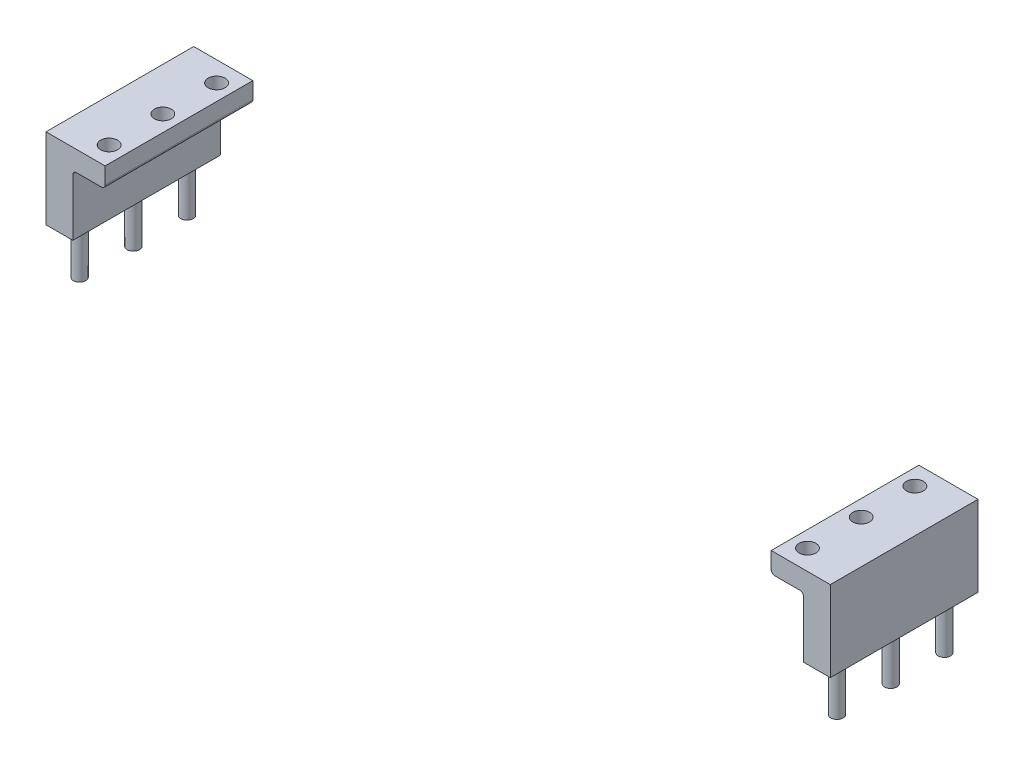
ISO-10303-21;
HEADER;
FILE_DESCRIPTION(('STEP AP214'),'2;1');
FILE_NAME('part.step','',(''),(''),'','','');
FILE_SCHEMA(('AUTOMOTIVE_DESIGN { 1 0 10303 214 1 1 1 1 }'));
ENDSEC;
DATA;
#1=APPLICATION_CONTEXT('core data for automotive mechanical design processes');
#2=APPLICATION_PROTOCOL_DEFINITION('international standard','automotive_design',2000,#1);
#3=PRODUCT_CONTEXT('',#1,'mechanical');
#4=PRODUCT('Part','Part','',(#3));
#5=PRODUCT_RELATED_PRODUCT_CATEGORY('part','',(#4));
#6=PRODUCT_DEFINITION_FORMATION('','',#4);
#7=PRODUCT_DEFINITION_CONTEXT('part definition',#1,'design');
#8=PRODUCT_DEFINITION('design','',#6,#7);
#9=PRODUCT_DEFINITION_SHAPE('','',#8);
#10=(LENGTH_UNIT() NAMED_UNIT(*) SI_UNIT(.MILLI.,.METRE.));
#11=(NAMED_UNIT(*) PLANE_ANGLE_UNIT() SI_UNIT($,.RADIAN.));
#12=(NAMED_UNIT(*) SI_UNIT($,.STERADIAN.) SOLID_ANGLE_UNIT());
#13=UNCERTAINTY_MEASURE_WITH_UNIT(LENGTH_MEASURE(1.E-05),#10,'distance_accuracy_value','');
#14=(GEOMETRIC_REPRESENTATION_CONTEXT(3) GLOBAL_UNCERTAINTY_ASSIGNED_CONTEXT((#13)) GLOBAL_UNIT_ASSIGNED_CONTEXT((#10,
#11,#12)) REPRESENTATION_CONTEXT('',''));
#15=CARTESIAN_POINT('',(0.,0.,0.));
#16=DIRECTION('',(0.,0.,1.));
#17=DIRECTION('',(1.,0.,0.));
#18=AXIS2_PLACEMENT_3D('',#15,#16,#17);
#19=CARTESIAN_POINT('',(184.05475,-81.3562,76.2));
#20=DIRECTION('',(0.,1.,0.));
#21=DIRECTION('',(0.,0.,1.));
#22=AXIS2_PLACEMENT_3D('',#19,#20,#21);
#23=PLANE('',#22);
#24=CARTESIAN_POINT('',(184.785,-81.3562,76.2));
#25=DIRECTION('',(0.,1.,0.));
#26=DIRECTION('',(0.,0.,-1.));
#27=AXIS2_PLACEMENT_3D('',#24,#25,#26);
#28=CIRCLE('',#27,1.4605);
#29=CARTESIAN_POINT('',(184.785,-81.3562,74.7395));
#30=VERTEX_POINT('',#29);
#31=EDGE_CURVE('P0_E11',#30,#30,#28,.T.);
#32=ORIENTED_EDGE('',*,*,#31,.F.);
#33=EDGE_LOOP('',(#32));
#34=FACE_BOUND('',#33,.T.);
#35=ADVANCED_FACE('P0_F17',(#34),#23,.F.);
#36=CARTESIAN_POINT('',(184.785,-75.6031,76.2));
#37=DIRECTION('',(0.,-1.,0.));
#38=DIRECTION('',(0.,0.,-1.));
#39=AXIS2_PLACEMENT_3D('',#36,#37,#38);
#40=CYLINDRICAL_SURFACE('',#39,1.4605);
#41=ORIENTED_EDGE('',*,*,#31,.T.);
#42=EDGE_LOOP('',(#41));
#43=FACE_BOUND('',#42,.T.);
#44=CARTESIAN_POINT('',(184.785,-71.12,76.2));
#45=DIRECTION('',(0.,1.,0.));
#46=DIRECTION('',(0.,0.,-1.));
#47=AXIS2_PLACEMENT_3D('',#44,#45,#46);
#48=CIRCLE('',#47,1.4605);
#49=CARTESIAN_POINT('',(184.785,-71.12,74.7395));
#50=VERTEX_POINT('',#49);
#51=EDGE_CURVE('P0_E164',#50,#50,#48,.T.);
#52=ORIENTED_EDGE('',*,*,#51,.F.);
#53=EDGE_LOOP('',(#52));
#54=FACE_BOUND('',#53,.T.);
#55=ADVANCED_FACE('P0_F175',(#43,#54),#40,.T.);
#56=CARTESIAN_POINT('',(184.785,-69.85,76.2));
#57=DIRECTION('',(0.,1.,0.));
#58=DIRECTION('',(0.,0.,1.));
#59=AXIS2_PLACEMENT_3D('',#56,#57,#58);
#60=CONICAL_SURFACE('',#59,2.7686,0.800175412804941);
#61=ORIENTED_EDGE('',*,*,#51,.T.);
#62=EDGE_LOOP('',(#61));
#63=FACE_BOUND('',#62,.T.);
#64=CARTESIAN_POINT('',(184.785,-69.85,76.2));
#65=DIRECTION('',(0.,1.,0.));
#66=DIRECTION('',(0.,0.,-1.));
#67=AXIS2_PLACEMENT_3D('',#64,#65,#66);
#68=CIRCLE('',#67,2.7686);
#69=CARTESIAN_POINT('',(184.785,-69.85,73.4314));
#70=VERTEX_POINT('',#69);
#71=EDGE_CURVE('P0_E24',#70,#70,#68,.T.);
#72=ORIENTED_EDGE('',*,*,#71,.F.);
#73=EDGE_LOOP('',(#72));
#74=FACE_BOUND('',#73,.T.);
#75=ADVANCED_FACE('P0_F172',(#63,#74),#60,.T.);
#76=CARTESIAN_POINT('',(184.05475,-81.3562,88.9));
#77=DIRECTION('',(0.,1.,0.));
#78=DIRECTION('',(0.,0.,1.));
#79=AXIS2_PLACEMENT_3D('',#76,#77,#78);
#80=PLANE('',#79);
#81=CARTESIAN_POINT('',(184.785,-81.3562,88.9));
#82=DIRECTION('',(0.,1.,0.));
#83=DIRECTION('',(0.,0.,-1.));
#84=AXIS2_PLACEMENT_3D('',#81,#82,#83);
#85=CIRCLE('',#84,1.4605);
#86=CARTESIAN_POINT('',(184.785,-81.3562,87.4395));
#87=VERTEX_POINT('',#86);
#88=EDGE_CURVE('P0_E161',#87,#87,#85,.T.);
#89=ORIENTED_EDGE('',*,*,#88,.F.);
#90=EDGE_LOOP('',(#89));
#91=FACE_BOUND('',#90,.T.);
#92=ADVANCED_FACE('P0_F174',(#91),#80,.F.);
#93=CARTESIAN_POINT('',(184.785,-75.6031,88.9));
#94=DIRECTION('',(0.,-1.,0.));
#95=DIRECTION('',(0.,0.,-1.));
#96=AXIS2_PLACEMENT_3D('',#93,#94,#95);
#97=CYLINDRICAL_SURFACE('',#96,1.4605);
#98=ORIENTED_EDGE('',*,*,#88,.T.);
#99=EDGE_LOOP('',(#98));
#100=FACE_BOUND('',#99,.T.);
#101=CARTESIAN_POINT('',(184.785,-71.12,88.9));
#102=DIRECTION('',(0.,1.,0.));
#103=DIRECTION('',(0.,0.,-1.));
#104=AXIS2_PLACEMENT_3D('',#101,#102,#103);
#105=CIRCLE('',#104,1.4605);
#106=CARTESIAN_POINT('',(184.785,-71.12,87.4395));
#107=VERTEX_POINT('',#106);
#108=EDGE_CURVE('P0_E155',#107,#107,#105,.T.);
#109=ORIENTED_EDGE('',*,*,#108,.F.);
#110=EDGE_LOOP('',(#109));
#111=FACE_BOUND('',#110,.T.);
#112=ADVANCED_FACE('P0_F183',(#100,#111),#97,.T.);
#113=CARTESIAN_POINT('',(184.785,-69.85,88.9));
#114=DIRECTION('',(0.,1.,0.));
#115=DIRECTION('',(0.,0.,1.));
#116=AXIS2_PLACEMENT_3D('',#113,#114,#115);
#117=CONICAL_SURFACE('',#116,2.7686,0.800175412804941);
#118=ORIENTED_EDGE('',*,*,#108,.T.);
#119=EDGE_LOOP('',(#118));
#120=FACE_BOUND('',#119,.T.);
#121=CARTESIAN_POINT('',(184.785,-69.85,88.9));
#122=DIRECTION('',(0.,1.,0.));
#123=DIRECTION('',(0.,0.,-1.));
#124=AXIS2_PLACEMENT_3D('',#121,#122,#123);
#125=CIRCLE('',#124,2.7686);
#126=CARTESIAN_POINT('',(184.785,-69.85,86.1314));
#127=VERTEX_POINT('',#126);
#128=EDGE_CURVE('P0_E158',#127,#127,#125,.T.);
#129=ORIENTED_EDGE('',*,*,#128,.F.);
#130=EDGE_LOOP('',(#129));
#131=FACE_BOUND('',#130,.T.);
#132=ADVANCED_FACE('P0_F222',(#120,#131),#117,.T.);
#133=CARTESIAN_POINT('',(173.99,-53.18125,106.3625));
#134=DIRECTION('',(1.,0.,0.));
#135=DIRECTION('',(0.,0.,1.));
#136=AXIS2_PLACEMENT_3D('',#133,#134,#135);
#137=PLANE('',#136);
#138=DIRECTION('',(0.,1.,0.));
#139=VECTOR('',#138,1.);
#140=CARTESIAN_POINT('',(173.99,-53.18125,106.3625));
#141=LINE('',#140,#139);
#142=CARTESIAN_POINT('',(173.99,-54.7243,106.3625));
#143=VERTEX_POINT('',#142);
#144=CARTESIAN_POINT('',(173.99,-50.8,106.3625));
#145=VERTEX_POINT('',#144);
#146=EDGE_CURVE('P0_E82',#143,#145,#141,.T.);
#147=ORIENTED_EDGE('',*,*,#146,.T.);
#148=DIRECTION('',(0.,0.,-1.));
#149=VECTOR('',#148,1.);
#150=CARTESIAN_POINT('',(173.99,-50.8,106.3625));
#151=LINE('',#150,#149);
#152=CARTESIAN_POINT('',(173.99,-50.8,71.4375));
#153=VERTEX_POINT('',#152);
#154=EDGE_CURVE('P0_E90',#145,#153,#151,.T.);
#155=ORIENTED_EDGE('',*,*,#154,.T.);
#156=DIRECTION('',(0.,1.,0.));
#157=VECTOR('',#156,1.);
#158=CARTESIAN_POINT('',(173.99,-53.18125,71.4375));
#159=LINE('',#158,#157);
#160=CARTESIAN_POINT('',(173.99,-54.7243,71.4375));
#161=VERTEX_POINT('',#160);
#162=EDGE_CURVE('P0_E123',#161,#153,#159,.T.);
#163=ORIENTED_EDGE('',*,*,#162,.F.);
#164=DIRECTION('',(0.,0.,-1.));
#165=VECTOR('',#164,1.);
#166=CARTESIAN_POINT('',(173.99,-54.7243,106.3625));
#167=LINE('',#166,#165);
#168=EDGE_CURVE('P0_E97',#143,#161,#167,.T.);
#169=ORIENTED_EDGE('',*,*,#168,.F.);
#170=EDGE_LOOP('',(#147,#155,#163,#169));
#171=FACE_BOUND('',#170,.T.);
#172=ADVANCED_FACE('P0_F101',(#171),#137,.F.);
#173=CARTESIAN_POINT('',(180.975,-50.8,106.3625));
#174=DIRECTION('',(0.,-1.,0.));
#175=DIRECTION('',(0.,0.,-1.));
#176=AXIS2_PLACEMENT_3D('',#173,#174,#175);
#177=PLANE('',#176);
#178=CARTESIAN_POINT('',(177.8,-50.8,101.6));
#179=DIRECTION('',(0.,1.,0.));
#180=DIRECTION('',(0.,0.,-1.));
#181=AXIS2_PLACEMENT_3D('',#178,#179,#180);
#182=CIRCLE('',#181,1.9939);
#183=CARTESIAN_POINT('',(177.8,-50.8,99.6061));
#184=VERTEX_POINT('',#183);
#185=EDGE_CURVE('P0_E109',#184,#184,#182,.T.);
#186=ORIENTED_EDGE('',*,*,#185,.F.);
#187=EDGE_LOOP('',(#186));
#188=FACE_BOUND('',#187,.T.);
#189=CARTESIAN_POINT('',(177.8,-50.8,88.9));
#190=DIRECTION('',(0.,1.,0.));
#191=DIRECTION('',(0.,0.,-1.));
#192=AXIS2_PLACEMENT_3D('',#189,#190,#191);
#193=CIRCLE('',#192,1.9939);
#194=CARTESIAN_POINT('',(177.8,-50.8,86.9061));
#195=VERTEX_POINT('',#194);
#196=EDGE_CURVE('P0_E415',#195,#195,#193,.T.);
#197=ORIENTED_EDGE('',*,*,#196,.F.);
#198=EDGE_LOOP('',(#197));
#199=FACE_BOUND('',#198,.T.);
#200=CARTESIAN_POINT('',(177.8,-50.8,76.2));
#201=DIRECTION('',(0.,1.,0.));
#202=DIRECTION('',(0.,0.,-1.));
#203=AXIS2_PLACEMENT_3D('',#200,#201,#202);
#204=CIRCLE('',#203,1.9939);
#205=CARTESIAN_POINT('',(177.8,-50.8,74.2061));
#206=VERTEX_POINT('',#205);
#207=EDGE_CURVE('P0_E408',#206,#206,#204,.T.);
#208=ORIENTED_EDGE('',*,*,#207,.F.);
#209=EDGE_LOOP('',(#208));
#210=FACE_BOUND('',#209,.T.);
#211=DIRECTION('',(1.,0.,0.));
#212=VECTOR('',#211,1.);
#213=CARTESIAN_POINT('',(180.975,-50.8,71.4375));
#214=LINE('',#213,#212);
#215=CARTESIAN_POINT('',(187.96,-50.8,71.4375));
#216=VERTEX_POINT('',#215);
#217=EDGE_CURVE('P0_E93',#153,#216,#214,.T.);
#218=ORIENTED_EDGE('',*,*,#217,.F.);
#219=ORIENTED_EDGE('',*,*,#154,.F.);
#220=DIRECTION('',(1.,0.,0.));
#221=VECTOR('',#220,1.);
#222=CARTESIAN_POINT('',(180.975,-50.8,106.3625));
#223=LINE('',#222,#221);
#224=CARTESIAN_POINT('',(187.96,-50.8,106.3625));
#225=VERTEX_POINT('',#224);
#226=EDGE_CURVE('P0_E78',#145,#225,#223,.T.);
#227=ORIENTED_EDGE('',*,*,#226,.T.);
#228=DIRECTION('',(0.,0.,-1.));
#229=VECTOR('',#228,1.);
#230=CARTESIAN_POINT('',(187.96,-50.8,106.3625));
#231=LINE('',#230,#229);
#232=EDGE_CURVE('P0_E98',#225,#216,#231,.T.);
#233=ORIENTED_EDGE('',*,*,#232,.T.);
#234=EDGE_LOOP('',(#218,#219,#227,#233));
#235=FACE_BOUND('',#234,.T.);
#236=ADVANCED_FACE('P0_F91',(#188,#199,#210,#235),#177,.F.);
#237=CARTESIAN_POINT('',(187.96,-60.325,106.3625));
#238=DIRECTION('',(-1.,0.,0.));
#239=DIRECTION('',(0.,1.,0.));
#240=AXIS2_PLACEMENT_3D('',#237,#238,#239);
#241=PLANE('',#240);
#242=DIRECTION('',(0.,-1.,0.));
#243=VECTOR('',#242,1.);
#244=CARTESIAN_POINT('',(187.96,-60.325,71.4375));
#245=LINE('',#244,#243);
#246=CARTESIAN_POINT('',(187.96,-69.85,71.4375));
#247=VERTEX_POINT('',#246);
#248=EDGE_CURVE('P0_E126',#216,#247,#245,.T.);
#249=ORIENTED_EDGE('',*,*,#248,.F.);
#250=ORIENTED_EDGE('',*,*,#232,.F.);
#251=DIRECTION('',(0.,-1.,0.));
#252=VECTOR('',#251,1.);
#253=CARTESIAN_POINT('',(187.96,-60.325,106.3625));
#254=LINE('',#253,#252);
#255=CARTESIAN_POINT('',(187.96,-69.85,106.3625));
#256=VERTEX_POINT('',#255);
#257=EDGE_CURVE('P0_E84',#225,#256,#254,.T.);
#258=ORIENTED_EDGE('',*,*,#257,.T.);
#259=DIRECTION('',(0.,0.,-1.));
#260=VECTOR('',#259,1.);
#261=CARTESIAN_POINT('',(187.96,-69.85,106.3625));
#262=LINE('',#261,#260);
#263=EDGE_CURVE('P0_E136',#256,#247,#262,.T.);
#264=ORIENTED_EDGE('',*,*,#263,.T.);
#265=EDGE_LOOP('',(#249,#250,#258,#264));
#266=FACE_BOUND('',#265,.T.);
#267=ADVANCED_FACE('P0_F249',(#266),#241,.F.);
#268=CARTESIAN_POINT('',(184.785,-69.85,106.3625));
#269=DIRECTION('',(0.,1.,0.));
#270=DIRECTION('',(0.,0.,1.));
#271=AXIS2_PLACEMENT_3D('',#268,#269,#270);
#272=PLANE('',#271);
#273=ORIENTED_EDGE('',*,*,#71,.T.);
#274=EDGE_LOOP('',(#273));
#275=FACE_BOUND('',#274,.T.);
#276=ORIENTED_EDGE('',*,*,#128,.T.);
#277=EDGE_LOOP('',(#276));
#278=FACE_BOUND('',#277,.T.);
#279=CARTESIAN_POINT('',(184.785,-69.85,101.6));
#280=DIRECTION('',(0.,1.,0.));
#281=DIRECTION('',(0.,0.,-1.));
#282=AXIS2_PLACEMENT_3D('',#279,#280,#281);
#283=CIRCLE('',#282,2.7686);
#284=CARTESIAN_POINT('',(184.785,-69.85,98.8314));
#285=VERTEX_POINT('',#284);
#286=EDGE_CURVE('P0_E154',#285,#285,#283,.T.);
#287=ORIENTED_EDGE('',*,*,#286,.T.);
#288=EDGE_LOOP('',(#287));
#289=FACE_BOUND('',#288,.T.);
#290=DIRECTION('',(-1.,0.,0.));
#291=VECTOR('',#290,1.);
#292=CARTESIAN_POINT('',(184.785,-69.85,71.4375));
#293=LINE('',#292,#291);
#294=CARTESIAN_POINT('',(181.61,-69.85,71.4375));
#295=VERTEX_POINT('',#294);
#296=EDGE_CURVE('P0_E129',#247,#295,#293,.T.);
#297=ORIENTED_EDGE('',*,*,#296,.F.);
#298=ORIENTED_EDGE('',*,*,#263,.F.);
#299=DIRECTION('',(-1.,0.,0.));
#300=VECTOR('',#299,1.);
#301=CARTESIAN_POINT('',(184.785,-69.85,106.3625));
#302=LINE('',#301,#300);
#303=CARTESIAN_POINT('',(181.61,-69.85,106.3625));
#304=VERTEX_POINT('',#303);
#305=EDGE_CURVE('P0_E113',#256,#304,#302,.T.);
#306=ORIENTED_EDGE('',*,*,#305,.T.);
#307=DIRECTION('',(0.,0.,-1.));
#308=VECTOR('',#307,1.);
#309=CARTESIAN_POINT('',(181.61,-69.85,106.3625));
#310=LINE('',#309,#308);
#311=EDGE_CURVE('P0_E122',#304,#295,#310,.T.);
#312=ORIENTED_EDGE('',*,*,#311,.T.);
#313=EDGE_LOOP('',(#297,#298,#306,#312));
#314=FACE_BOUND('',#313,.T.);
#315=ADVANCED_FACE('P0_F169',(#275,#278,#289,#314),#272,.F.);
#316=CARTESIAN_POINT('',(181.61,-62.70625,106.3625));
#317=DIRECTION('',(1.,0.,0.));
#318=DIRECTION('',(0.,0.,1.));
#319=AXIS2_PLACEMENT_3D('',#316,#317,#318);
#320=PLANE('',#319);
#321=DIRECTION('',(0.,1.,0.));
#322=VECTOR('',#321,1.);
#323=CARTESIAN_POINT('',(181.61,-62.70625,71.4375));
#324=LINE('',#323,#322);
#325=CARTESIAN_POINT('',(181.61,-56.4007,71.4375));
#326=VERTEX_POINT('',#325);
#327=EDGE_CURVE('P0_E106',#295,#326,#324,.T.);
#328=ORIENTED_EDGE('',*,*,#327,.F.);
#329=ORIENTED_EDGE('',*,*,#311,.F.);
#330=DIRECTION('',(0.,1.,0.));
#331=VECTOR('',#330,1.);
#332=CARTESIAN_POINT('',(181.61,-62.70625,106.3625));
#333=LINE('',#332,#331);
#334=CARTESIAN_POINT('',(181.61,-56.4007,106.3625));
#335=VERTEX_POINT('',#334);
#336=EDGE_CURVE('P0_E116',#304,#335,#333,.T.);
#337=ORIENTED_EDGE('',*,*,#336,.T.);
#338=DIRECTION('',(0.,0.,-1.));
#339=VECTOR('',#338,1.);
#340=CARTESIAN_POINT('',(181.61,-56.4007,106.3625));
#341=LINE('',#340,#339);
#342=EDGE_CURVE('P0_E149',#326,#335,#341,.F.);
#343=ORIENTED_EDGE('',*,*,#342,.F.);
#344=EDGE_LOOP('',(#328,#329,#337,#343));
#345=FACE_BOUND('',#344,.T.);
#346=ADVANCED_FACE('P0_F268',(#345),#320,.F.);
#347=CARTESIAN_POINT('',(177.8,-55.5625,106.3625));
#348=DIRECTION('',(0.,1.,0.));
#349=DIRECTION('',(0.,0.,1.));
#350=AXIS2_PLACEMENT_3D('',#347,#348,#349);
#351=PLANE('',#350);
#352=CARTESIAN_POINT('',(177.8,-55.5625,101.6));
#353=DIRECTION('',(0.,1.,0.));
#354=DIRECTION('',(0.,0.,-1.));
#355=AXIS2_PLACEMENT_3D('',#352,#353,#354);
#356=CIRCLE('',#355,1.9939);
#357=CARTESIAN_POINT('',(177.8,-55.5625,99.6061));
#358=VERTEX_POINT('',#357);
#359=EDGE_CURVE('P0_E405',#358,#358,#356,.T.);
#360=ORIENTED_EDGE('',*,*,#359,.T.);
#361=EDGE_LOOP('',(#360));
#362=FACE_BOUND('',#361,.T.);
#363=CARTESIAN_POINT('',(177.8,-55.5625,88.9));
#364=DIRECTION('',(0.,1.,0.));
#365=DIRECTION('',(0.,0.,-1.));
#366=AXIS2_PLACEMENT_3D('',#363,#364,#365);
#367=CIRCLE('',#366,1.9939);
#368=CARTESIAN_POINT('',(177.8,-55.5625,86.9061));
#369=VERTEX_POINT('',#368);
#370=EDGE_CURVE('P0_E409',#369,#369,#367,.T.);
#371=ORIENTED_EDGE('',*,*,#370,.T.);
#372=EDGE_LOOP('',(#371));
#373=FACE_BOUND('',#372,.T.);
#374=CARTESIAN_POINT('',(177.8,-55.5625,76.2));
#375=DIRECTION('',(0.,1.,0.));
#376=DIRECTION('',(0.,0.,-1.));
#377=AXIS2_PLACEMENT_3D('',#374,#375,#376);
#378=CIRCLE('',#377,1.9939);
#379=CARTESIAN_POINT('',(177.8,-55.5625,74.2061));
#380=VERTEX_POINT('',#379);
#381=EDGE_CURVE('P0_E404',#380,#380,#378,.T.);
#382=ORIENTED_EDGE('',*,*,#381,.T.);
#383=EDGE_LOOP('',(#382));
#384=FACE_BOUND('',#383,.T.);
#385=DIRECTION('',(-1.,0.,0.));
#386=VECTOR('',#385,1.);
#387=CARTESIAN_POINT('',(177.8,-55.5625,71.4375));
#388=LINE('',#387,#386);
#389=CARTESIAN_POINT('',(180.7718,-55.5625,71.4375));
#390=VERTEX_POINT('',#389);
#391=CARTESIAN_POINT('',(174.8282,-55.5625,71.4375));
#392=VERTEX_POINT('',#391);
#393=EDGE_CURVE('P0_E103',#390,#392,#388,.T.);
#394=ORIENTED_EDGE('',*,*,#393,.F.);
#395=DIRECTION('',(0.,0.,-1.));
#396=VECTOR('',#395,1.);
#397=CARTESIAN_POINT('',(180.7718,-55.5625,71.4375));
#398=LINE('',#397,#396);
#399=CARTESIAN_POINT('',(180.7718,-55.5625,106.3625));
#400=VERTEX_POINT('',#399);
#401=EDGE_CURVE('P0_E143',#400,#390,#398,.T.);
#402=ORIENTED_EDGE('',*,*,#401,.F.);
#403=DIRECTION('',(-1.,0.,0.));
#404=VECTOR('',#403,1.);
#405=CARTESIAN_POINT('',(177.8,-55.5625,106.3625));
#406=LINE('',#405,#404);
#407=CARTESIAN_POINT('',(174.8282,-55.5625,106.3625));
#408=VERTEX_POINT('',#407);
#409=EDGE_CURVE('P0_E119',#400,#408,#406,.T.);
#410=ORIENTED_EDGE('',*,*,#409,.T.);
#411=DIRECTION('',(0.,0.,-1.));
#412=VECTOR('',#411,1.);
#413=CARTESIAN_POINT('',(174.8282,-55.5625,106.3625));
#414=LINE('',#413,#412);
#415=EDGE_CURVE('P0_E146',#392,#408,#414,.F.);
#416=ORIENTED_EDGE('',*,*,#415,.F.);
#417=EDGE_LOOP('',(#394,#402,#410,#416));
#418=FACE_BOUND('',#417,.T.);
#419=ADVANCED_FACE('P0_F277',(#362,#373,#384,#418),#351,.F.);
#420=CARTESIAN_POINT('',(180.975,-60.325,106.3625));
#421=DIRECTION('',(0.,0.,1.));
#422=DIRECTION('',(-1.,0.,0.));
#423=AXIS2_PLACEMENT_3D('',#420,#421,#422);
#424=PLANE('',#423);
#425=ORIENTED_EDGE('',*,*,#409,.F.);
#426=CARTESIAN_POINT('',(180.7718,-56.4007,106.3625));
#427=DIRECTION('',(0.,0.,-1.));
#428=DIRECTION('',(-1.,0.,0.));
#429=AXIS2_PLACEMENT_3D('',#426,#427,#428);
#430=CIRCLE('',#429,0.8382);
#431=EDGE_CURVE('P0_E31',#335,#400,#430,.F.);
#432=ORIENTED_EDGE('',*,*,#431,.F.);
#433=ORIENTED_EDGE('',*,*,#336,.F.);
#434=ORIENTED_EDGE('',*,*,#305,.F.);
#435=ORIENTED_EDGE('',*,*,#257,.F.);
#436=ORIENTED_EDGE('',*,*,#226,.F.);
#437=ORIENTED_EDGE('',*,*,#146,.F.);
#438=CARTESIAN_POINT('',(174.8282,-54.7243,106.3625));
#439=DIRECTION('',(0.,0.,-1.));
#440=DIRECTION('',(-1.,0.,0.));
#441=AXIS2_PLACEMENT_3D('',#438,#439,#440);
#442=CIRCLE('',#441,0.8382);
#443=EDGE_CURVE('P0_E37',#408,#143,#442,.T.);
#444=ORIENTED_EDGE('',*,*,#443,.F.);
#445=EDGE_LOOP('',(#425,#432,#433,#434,#435,#436,#437,#444));
#446=FACE_BOUND('',#445,.T.);
#447=ADVANCED_FACE('P0_F80',(#446),#424,.T.);
#448=CARTESIAN_POINT('',(180.975,-60.325,71.4375));
#449=DIRECTION('',(0.,0.,1.));
#450=DIRECTION('',(-1.,0.,0.));
#451=AXIS2_PLACEMENT_3D('',#448,#449,#450);
#452=PLANE('',#451);
#453=ORIENTED_EDGE('',*,*,#162,.T.);
#454=ORIENTED_EDGE('',*,*,#217,.T.);
#455=ORIENTED_EDGE('',*,*,#248,.T.);
#456=ORIENTED_EDGE('',*,*,#296,.T.);
#457=ORIENTED_EDGE('',*,*,#327,.T.);
#458=CARTESIAN_POINT('',(180.7718,-56.4007,71.4375));
#459=DIRECTION('',(0.,0.,-1.));
#460=DIRECTION('',(-1.,0.,0.));
#461=AXIS2_PLACEMENT_3D('',#458,#459,#460);
#462=CIRCLE('',#461,0.8382);
#463=EDGE_CURVE('P0_E151',#390,#326,#462,.T.);
#464=ORIENTED_EDGE('',*,*,#463,.F.);
#465=ORIENTED_EDGE('',*,*,#393,.T.);
#466=CARTESIAN_POINT('',(174.8282,-54.7243,71.4375));
#467=DIRECTION('',(0.,0.,-1.));
#468=DIRECTION('',(-1.,0.,0.));
#469=AXIS2_PLACEMENT_3D('',#466,#467,#468);
#470=CIRCLE('',#469,0.8382);
#471=EDGE_CURVE('P0_E141',#161,#392,#470,.F.);
#472=ORIENTED_EDGE('',*,*,#471,.F.);
#473=EDGE_LOOP('',(#453,#454,#455,#456,#457,#464,#465,#472));
#474=FACE_BOUND('',#473,.T.);
#475=ADVANCED_FACE('P0_F296',(#474),#452,.F.);
#476=CARTESIAN_POINT('',(177.8,-30.1625,76.2));
#477=DIRECTION('',(0.,-1.,0.));
#478=DIRECTION('',(0.,0.,-1.));
#479=AXIS2_PLACEMENT_3D('',#476,#477,#478);
#480=CYLINDRICAL_SURFACE('',#479,1.9939);
#481=ORIENTED_EDGE('',*,*,#381,.F.);
#482=EDGE_LOOP('',(#481));
#483=FACE_BOUND('',#482,.T.);
#484=ORIENTED_EDGE('',*,*,#207,.T.);
#485=EDGE_LOOP('',(#484));
#486=FACE_BOUND('',#485,.T.);
#487=ADVANCED_FACE('P0_F305',(#483,#486),#480,.F.);
#488=CARTESIAN_POINT('',(177.8,-30.1625,88.9));
#489=DIRECTION('',(0.,-1.,0.));
#490=DIRECTION('',(0.,0.,-1.));
#491=AXIS2_PLACEMENT_3D('',#488,#489,#490);
#492=CYLINDRICAL_SURFACE('',#491,1.9939);
#493=ORIENTED_EDGE('',*,*,#370,.F.);
#494=EDGE_LOOP('',(#493));
#495=FACE_BOUND('',#494,.T.);
#496=ORIENTED_EDGE('',*,*,#196,.T.);
#497=EDGE_LOOP('',(#496));
#498=FACE_BOUND('',#497,.T.);
#499=ADVANCED_FACE('P0_F315',(#495,#498),#492,.F.);
#500=CARTESIAN_POINT('',(177.8,-30.1625,101.6));
#501=DIRECTION('',(0.,-1.,0.));
#502=DIRECTION('',(0.,0.,-1.));
#503=AXIS2_PLACEMENT_3D('',#500,#501,#502);
#504=CYLINDRICAL_SURFACE('',#503,1.9939);
#505=ORIENTED_EDGE('',*,*,#359,.F.);
#506=EDGE_LOOP('',(#505));
#507=FACE_BOUND('',#506,.T.);
#508=ORIENTED_EDGE('',*,*,#185,.T.);
#509=EDGE_LOOP('',(#508));
#510=FACE_BOUND('',#509,.T.);
#511=ADVANCED_FACE('P0_F325',(#507,#510),#504,.F.);
#512=CARTESIAN_POINT('',(174.8282,-54.7243,106.3625));
#513=DIRECTION('',(0.,0.,-1.));
#514=DIRECTION('',(1.,0.,0.));
#515=AXIS2_PLACEMENT_3D('',#512,#513,#514);
#516=CYLINDRICAL_SURFACE('',#515,0.8382);
#517=ORIENTED_EDGE('',*,*,#443,.T.);
#518=ORIENTED_EDGE('',*,*,#168,.T.);
#519=ORIENTED_EDGE('',*,*,#471,.T.);
#520=ORIENTED_EDGE('',*,*,#415,.T.);
#521=EDGE_LOOP('',(#517,#518,#519,#520));
#522=FACE_BOUND('',#521,.T.);
#523=ADVANCED_FACE('P0_F335',(#522),#516,.T.);
#524=CARTESIAN_POINT('',(180.7718,-56.4007,106.3625));
#525=DIRECTION('',(0.,0.,1.));
#526=DIRECTION('',(-1.,0.,0.));
#527=AXIS2_PLACEMENT_3D('',#524,#525,#526);
#528=CYLINDRICAL_SURFACE('',#527,0.8382);
#529=ORIENTED_EDGE('',*,*,#431,.T.);
#530=ORIENTED_EDGE('',*,*,#401,.T.);
#531=ORIENTED_EDGE('',*,*,#463,.T.);
#532=ORIENTED_EDGE('',*,*,#342,.T.);
#533=EDGE_LOOP('',(#529,#530,#531,#532));
#534=FACE_BOUND('',#533,.T.);
#535=ADVANCED_FACE('P0_F345',(#534),#528,.F.);
#536=CARTESIAN_POINT('',(184.05475,-81.3562,101.6));
#537=DIRECTION('',(0.,1.,0.));
#538=DIRECTION('',(0.,0.,1.));
#539=AXIS2_PLACEMENT_3D('',#536,#537,#538);
#540=PLANE('',#539);
#541=CARTESIAN_POINT('',(184.785,-81.3562,101.6));
#542=DIRECTION('',(0.,1.,0.));
#543=DIRECTION('',(0.,0.,-1.));
#544=AXIS2_PLACEMENT_3D('',#541,#542,#543);
#545=CIRCLE('',#544,1.4605);
#546=CARTESIAN_POINT('',(184.785,-81.3562,100.1395));
#547=VERTEX_POINT('',#546);
#548=EDGE_CURVE('P0_E401',#547,#547,#545,.T.);
#549=ORIENTED_EDGE('',*,*,#548,.F.);
#550=EDGE_LOOP('',(#549));
#551=FACE_BOUND('',#550,.T.);
#552=ADVANCED_FACE('P0_F355',(#551),#540,.F.);
#553=CARTESIAN_POINT('',(184.785,-75.6031,101.6));
#554=DIRECTION('',(0.,-1.,0.));
#555=DIRECTION('',(0.,0.,-1.));
#556=AXIS2_PLACEMENT_3D('',#553,#554,#555);
#557=CYLINDRICAL_SURFACE('',#556,1.4605);
#558=ORIENTED_EDGE('',*,*,#548,.T.);
#559=EDGE_LOOP('',(#558));
#560=FACE_BOUND('',#559,.T.);
#561=CARTESIAN_POINT('',(184.785,-71.12,101.6));
#562=DIRECTION('',(0.,1.,0.));
#563=DIRECTION('',(0.,0.,-1.));
#564=AXIS2_PLACEMENT_3D('',#561,#562,#563);
#565=CIRCLE('',#564,1.4605);
#566=CARTESIAN_POINT('',(184.785,-71.12,100.1395));
#567=VERTEX_POINT('',#566);
#568=EDGE_CURVE('P0_E394',#567,#567,#565,.T.);
#569=ORIENTED_EDGE('',*,*,#568,.F.);
#570=EDGE_LOOP('',(#569));
#571=FACE_BOUND('',#570,.T.);
#572=ADVANCED_FACE('P0_F365',(#560,#571),#557,.T.);
#573=CARTESIAN_POINT('',(184.785,-69.85,101.6));
#574=DIRECTION('',(0.,1.,0.));
#575=DIRECTION('',(0.,0.,1.));
#576=AXIS2_PLACEMENT_3D('',#573,#574,#575);
#577=CONICAL_SURFACE('',#576,2.7686,0.800175412804941);
#578=ORIENTED_EDGE('',*,*,#568,.T.);
#579=EDGE_LOOP('',(#578));
#580=FACE_BOUND('',#579,.T.);
#581=ORIENTED_EDGE('',*,*,#286,.F.);
#582=EDGE_LOOP('',(#581));
#583=FACE_BOUND('',#582,.T.);
#584=ADVANCED_FACE('P0_F375',(#580,#583),#577,.T.);
#585=CLOSED_SHELL('',(#35,#55,#75,#92,#112,#132,#172,#236,#267,#315,#346,#419,#447,#475,#487,
#499,#511,#523,#535,#552,#572,#584));
#586=MANIFOLD_SOLID_BREP('P0_B1',#585);
#587=CARTESIAN_POINT('',(6.44524999999978,-81.3562,76.2));
#588=DIRECTION('',(0.,1.,0.));
#589=DIRECTION('',(0.,0.,1.));
#590=AXIS2_PLACEMENT_3D('',#587,#588,#589);
#591=PLANE('',#590);
#592=CARTESIAN_POINT('',(5.71499999999978,-81.3562,76.2));
#593=DIRECTION('',(0.,-1.,0.));
#594=DIRECTION('',(0.,0.,-1.));
#595=AXIS2_PLACEMENT_3D('',#592,#593,#594);
#596=CIRCLE('',#595,1.4605);
#597=CARTESIAN_POINT('',(5.71499999999978,-81.3562,74.7395));
#598=VERTEX_POINT('',#597);
#599=EDGE_CURVE('P1_E11',#598,#598,#596,.T.);
#600=ORIENTED_EDGE('',*,*,#599,.T.);
#601=EDGE_LOOP('',(#600));
#602=FACE_BOUND('',#601,.T.);
#603=ADVANCED_FACE('P1_F17',(#602),#591,.F.);
#604=CARTESIAN_POINT('',(5.71499999999978,-75.6031,76.2));
#605=DIRECTION('',(0.,-1.,0.));
#606=DIRECTION('',(0.,0.,-1.));
#607=AXIS2_PLACEMENT_3D('',#604,#605,#606);
#608=CYLINDRICAL_SURFACE('',#607,1.4605);
#609=ORIENTED_EDGE('',*,*,#599,.F.);
#610=EDGE_LOOP('',(#609));
#611=FACE_BOUND('',#610,.T.);
#612=CARTESIAN_POINT('',(5.71499999999978,-71.12,76.2));
#613=DIRECTION('',(0.,-1.,0.));
#614=DIRECTION('',(0.,0.,-1.));
#615=AXIS2_PLACEMENT_3D('',#612,#613,#614);
#616=CIRCLE('',#615,1.4605);
#617=CARTESIAN_POINT('',(5.71499999999978,-71.12,74.7395));
#618=VERTEX_POINT('',#617);
#619=EDGE_CURVE('P1_E139',#618,#618,#616,.T.);
#620=ORIENTED_EDGE('',*,*,#619,.T.);
#621=EDGE_LOOP('',(#620));
#622=FACE_BOUND('',#621,.T.);
#623=ADVANCED_FACE('P1_F227',(#611,#622),#608,.T.);
#624=CARTESIAN_POINT('',(5.71499999999978,-69.85,76.2));
#625=DIRECTION('',(0.,1.,0.));
#626=DIRECTION('',(0.,0.,1.));
#627=AXIS2_PLACEMENT_3D('',#624,#625,#626);
#628=CONICAL_SURFACE('',#627,2.7686,0.800175412804941);
#629=ORIENTED_EDGE('',*,*,#619,.F.);
#630=EDGE_LOOP('',(#629));
#631=FACE_BOUND('',#630,.T.);
#632=CARTESIAN_POINT('',(5.71499999999978,-69.85,76.2));
#633=DIRECTION('',(0.,-1.,0.));
#634=DIRECTION('',(0.,0.,-1.));
#635=AXIS2_PLACEMENT_3D('',#632,#633,#634);
#636=CIRCLE('',#635,2.7686);
#637=CARTESIAN_POINT('',(5.71499999999978,-69.85,73.4314));
#638=VERTEX_POINT('',#637);
#639=EDGE_CURVE('P1_E24',#638,#638,#636,.T.);
#640=ORIENTED_EDGE('',*,*,#639,.T.);
#641=EDGE_LOOP('',(#640));
#642=FACE_BOUND('',#641,.T.);
#643=ADVANCED_FACE('P1_F144',(#631,#642),#628,.T.);
#644=CARTESIAN_POINT('',(6.44524999999978,-81.3562,88.9));
#645=DIRECTION('',(0.,1.,0.));
#646=DIRECTION('',(0.,0.,1.));
#647=AXIS2_PLACEMENT_3D('',#644,#645,#646);
#648=PLANE('',#647);
#649=CARTESIAN_POINT('',(5.71499999999978,-81.3562,88.9));
#650=DIRECTION('',(0.,-1.,0.));
#651=DIRECTION('',(0.,0.,-1.));
#652=AXIS2_PLACEMENT_3D('',#649,#650,#651);
#653=CIRCLE('',#652,1.4605);
#654=CARTESIAN_POINT('',(5.71499999999978,-81.3562,87.4395));
#655=VERTEX_POINT('',#654);
#656=EDGE_CURVE('P1_E136',#655,#655,#653,.T.);
#657=ORIENTED_EDGE('',*,*,#656,.T.);
#658=EDGE_LOOP('',(#657));
#659=FACE_BOUND('',#658,.T.);
#660=ADVANCED_FACE('P1_F238',(#659),#648,.F.);
#661=CARTESIAN_POINT('',(5.71499999999978,-75.6031,88.9));
#662=DIRECTION('',(0.,-1.,0.));
#663=DIRECTION('',(0.,0.,-1.));
#664=AXIS2_PLACEMENT_3D('',#661,#662,#663);
#665=CYLINDRICAL_SURFACE('',#664,1.4605);
#666=ORIENTED_EDGE('',*,*,#656,.F.);
#667=EDGE_LOOP('',(#666));
#668=FACE_BOUND('',#667,.T.);
#669=CARTESIAN_POINT('',(5.71499999999978,-71.12,88.9));
#670=DIRECTION('',(0.,-1.,0.));
#671=DIRECTION('',(0.,0.,-1.));
#672=AXIS2_PLACEMENT_3D('',#669,#670,#671);
#673=CIRCLE('',#672,1.4605);
#674=CARTESIAN_POINT('',(5.71499999999978,-71.12,87.4395));
#675=VERTEX_POINT('',#674);
#676=EDGE_CURVE('P1_E130',#675,#675,#673,.T.);
#677=ORIENTED_EDGE('',*,*,#676,.T.);
#678=EDGE_LOOP('',(#677));
#679=FACE_BOUND('',#678,.T.);
#680=ADVANCED_FACE('P1_F243',(#668,#679),#665,.T.);
#681=CARTESIAN_POINT('',(5.71499999999978,-69.85,88.9));
#682=DIRECTION('',(0.,1.,0.));
#683=DIRECTION('',(0.,0.,1.));
#684=AXIS2_PLACEMENT_3D('',#681,#682,#683);
#685=CONICAL_SURFACE('',#684,2.7686,0.800175412804941);
#686=ORIENTED_EDGE('',*,*,#676,.F.);
#687=EDGE_LOOP('',(#686));
#688=FACE_BOUND('',#687,.T.);
#689=CARTESIAN_POINT('',(5.71499999999978,-69.85,88.9));
#690=DIRECTION('',(0.,-1.,0.));
#691=DIRECTION('',(0.,0.,-1.));
#692=AXIS2_PLACEMENT_3D('',#689,#690,#691);
#693=CIRCLE('',#692,2.7686);
#694=CARTESIAN_POINT('',(5.71499999999978,-69.85,86.1314));
#695=VERTEX_POINT('',#694);
#696=EDGE_CURVE('P1_E133',#695,#695,#693,.T.);
#697=ORIENTED_EDGE('',*,*,#696,.T.);
#698=EDGE_LOOP('',(#697));
#699=FACE_BOUND('',#698,.T.);
#700=ADVANCED_FACE('P1_F249',(#688,#699),#685,.T.);
#701=CARTESIAN_POINT('',(16.51,-53.18125,106.3625));
#702=DIRECTION('',(-1.,0.,0.));
#703=DIRECTION('',(0.,0.,1.));
#704=AXIS2_PLACEMENT_3D('',#701,#702,#703);
#705=PLANE('',#704);
#706=DIRECTION('',(0.,1.,0.));
#707=VECTOR('',#706,1.);
#708=CARTESIAN_POINT('',(16.51,-53.18125,106.3625));
#709=LINE('',#708,#707);
#710=CARTESIAN_POINT('',(16.51,-54.7243,106.3625));
#711=VERTEX_POINT('',#710);
#712=CARTESIAN_POINT('',(16.51,-50.8,106.3625));
#713=VERTEX_POINT('',#712);
#714=EDGE_CURVE('P1_E84',#711,#713,#709,.T.);
#715=ORIENTED_EDGE('',*,*,#714,.F.);
#716=DIRECTION('',(0.,0.,-1.));
#717=VECTOR('',#716,1.);
#718=CARTESIAN_POINT('',(16.51,-54.7243,106.3625));
#719=LINE('',#718,#717);
#720=CARTESIAN_POINT('',(16.51,-54.7243,71.4375));
#721=VERTEX_POINT('',#720);
#722=EDGE_CURVE('P1_E110',#711,#721,#719,.T.);
#723=ORIENTED_EDGE('',*,*,#722,.T.);
#724=DIRECTION('',(0.,1.,0.));
#725=VECTOR('',#724,1.);
#726=CARTESIAN_POINT('',(16.51,-53.18125,71.4375));
#727=LINE('',#726,#725);
#728=CARTESIAN_POINT('',(16.51,-50.8,71.4375));
#729=VERTEX_POINT('',#728);
#730=EDGE_CURVE('P1_E108',#721,#729,#727,.T.);
#731=ORIENTED_EDGE('',*,*,#730,.T.);
#732=DIRECTION('',(0.,0.,-1.));
#733=VECTOR('',#732,1.);
#734=CARTESIAN_POINT('',(16.51,-50.8,106.3625));
#735=LINE('',#734,#733);
#736=EDGE_CURVE('P1_E100',#713,#729,#735,.T.);
#737=ORIENTED_EDGE('',*,*,#736,.F.);
#738=EDGE_LOOP('',(#715,#723,#731,#737));
#739=FACE_BOUND('',#738,.T.);
#740=ADVANCED_FACE('P1_F106',(#739),#705,.F.);
#741=CARTESIAN_POINT('',(9.52499999999978,-50.8,106.3625));
#742=DIRECTION('',(0.,-1.,0.));
#743=DIRECTION('',(0.,0.,-1.));
#744=AXIS2_PLACEMENT_3D('',#741,#742,#743);
#745=PLANE('',#744);
#746=CARTESIAN_POINT('',(12.6999999999998,-50.8,101.6));
#747=DIRECTION('',(0.,-1.,0.));
#748=DIRECTION('',(0.,0.,-1.));
#749=AXIS2_PLACEMENT_3D('',#746,#747,#748);
#750=CIRCLE('',#749,1.9939);
#751=CARTESIAN_POINT('',(12.6999999999998,-50.8,99.6061));
#752=VERTEX_POINT('',#751);
#753=EDGE_CURVE('P1_E183',#752,#752,#750,.T.);
#754=ORIENTED_EDGE('',*,*,#753,.T.);
#755=EDGE_LOOP('',(#754));
#756=FACE_BOUND('',#755,.T.);
#757=CARTESIAN_POINT('',(12.6999999999998,-50.8,88.9));
#758=DIRECTION('',(0.,-1.,0.));
#759=DIRECTION('',(0.,0.,-1.));
#760=AXIS2_PLACEMENT_3D('',#757,#758,#759);
#761=CIRCLE('',#760,1.9939);
#762=CARTESIAN_POINT('',(12.6999999999998,-50.8,86.9061));
#763=VERTEX_POINT('',#762);
#764=EDGE_CURVE('P1_E191',#763,#763,#761,.T.);
#765=ORIENTED_EDGE('',*,*,#764,.T.);
#766=EDGE_LOOP('',(#765));
#767=FACE_BOUND('',#766,.T.);
#768=CARTESIAN_POINT('',(12.6999999999998,-50.8,76.2));
#769=DIRECTION('',(0.,-1.,0.));
#770=DIRECTION('',(0.,0.,-1.));
#771=AXIS2_PLACEMENT_3D('',#768,#769,#770);
#772=CIRCLE('',#771,1.9939);
#773=CARTESIAN_POINT('',(12.6999999999998,-50.8,74.2061));
#774=VERTEX_POINT('',#773);
#775=EDGE_CURVE('P1_E194',#774,#774,#772,.T.);
#776=ORIENTED_EDGE('',*,*,#775,.T.);
#777=EDGE_LOOP('',(#776));
#778=FACE_BOUND('',#777,.T.);
#779=DIRECTION('',(-1.,0.,0.));
#780=VECTOR('',#779,1.);
#781=CARTESIAN_POINT('',(9.52499999999978,-50.8,71.4375));
#782=LINE('',#781,#780);
#783=CARTESIAN_POINT('',(2.53999999999977,-50.8,71.4375));
#784=VERTEX_POINT('',#783);
#785=EDGE_CURVE('P1_E180',#729,#784,#782,.T.);
#786=ORIENTED_EDGE('',*,*,#785,.T.);
#787=DIRECTION('',(0.,0.,-1.));
#788=VECTOR('',#787,1.);
#789=CARTESIAN_POINT('',(2.53999999999977,-50.8,106.3625));
#790=LINE('',#789,#788);
#791=CARTESIAN_POINT('',(2.53999999999977,-50.8,106.3625));
#792=VERTEX_POINT('',#791);
#793=EDGE_CURVE('P1_E102',#792,#784,#790,.T.);
#794=ORIENTED_EDGE('',*,*,#793,.F.);
#795=DIRECTION('',(-1.,0.,0.));
#796=VECTOR('',#795,1.);
#797=CARTESIAN_POINT('',(9.52499999999978,-50.8,106.3625));
#798=LINE('',#797,#796);
#799=EDGE_CURVE('P1_E87',#713,#792,#798,.T.);
#800=ORIENTED_EDGE('',*,*,#799,.F.);
#801=ORIENTED_EDGE('',*,*,#736,.T.);
#802=EDGE_LOOP('',(#786,#794,#800,#801));
#803=FACE_BOUND('',#802,.T.);
#804=ADVANCED_FACE('P1_F99',(#756,#767,#778,#803),#745,.F.);
#805=CARTESIAN_POINT('',(2.53999999999977,-60.325,106.3625));
#806=DIRECTION('',(1.,0.,0.));
#807=DIRECTION('',(0.,1.,0.));
#808=AXIS2_PLACEMENT_3D('',#805,#806,#807);
#809=PLANE('',#808);
#810=DIRECTION('',(0.,-1.,0.));
#811=VECTOR('',#810,1.);
#812=CARTESIAN_POINT('',(2.53999999999977,-60.325,71.4375));
#813=LINE('',#812,#811);
#814=CARTESIAN_POINT('',(2.53999999999977,-69.85,71.4375));
#815=VERTEX_POINT('',#814);
#816=EDGE_CURVE('P1_E169',#784,#815,#813,.T.);
#817=ORIENTED_EDGE('',*,*,#816,.T.);
#818=DIRECTION('',(0.,0.,-1.));
#819=VECTOR('',#818,1.);
#820=CARTESIAN_POINT('',(2.53999999999977,-69.85,106.3625));
#821=LINE('',#820,#819);
#822=CARTESIAN_POINT('',(2.53999999999977,-69.85,106.3625));
#823=VERTEX_POINT('',#822);
#824=EDGE_CURVE('P1_E114',#823,#815,#821,.T.);
#825=ORIENTED_EDGE('',*,*,#824,.F.);
#826=DIRECTION('',(0.,-1.,0.));
#827=VECTOR('',#826,1.);
#828=CARTESIAN_POINT('',(2.53999999999977,-60.325,106.3625));
#829=LINE('',#828,#827);
#830=EDGE_CURVE('P1_E104',#792,#823,#829,.T.);
#831=ORIENTED_EDGE('',*,*,#830,.F.);
#832=ORIENTED_EDGE('',*,*,#793,.T.);
#833=EDGE_LOOP('',(#817,#825,#831,#832));
#834=FACE_BOUND('',#833,.T.);
#835=ADVANCED_FACE('P1_F150',(#834),#809,.F.);
#836=CARTESIAN_POINT('',(5.71499999999978,-69.85,106.3625));
#837=DIRECTION('',(0.,1.,0.));
#838=DIRECTION('',(0.,0.,1.));
#839=AXIS2_PLACEMENT_3D('',#836,#837,#838);
#840=PLANE('',#839);
#841=ORIENTED_EDGE('',*,*,#639,.F.);
#842=EDGE_LOOP('',(#841));
#843=FACE_BOUND('',#842,.T.);
#844=ORIENTED_EDGE('',*,*,#696,.F.);
#845=EDGE_LOOP('',(#844));
#846=FACE_BOUND('',#845,.T.);
#847=CARTESIAN_POINT('',(5.71499999999978,-69.85,101.6));
#848=DIRECTION('',(0.,-1.,0.));
#849=DIRECTION('',(0.,0.,-1.));
#850=AXIS2_PLACEMENT_3D('',#847,#848,#849);
#851=CIRCLE('',#850,2.7686);
#852=CARTESIAN_POINT('',(5.71499999999978,-69.85,98.8314));
#853=VERTEX_POINT('',#852);
#854=EDGE_CURVE('P1_E129',#853,#853,#851,.T.);
#855=ORIENTED_EDGE('',*,*,#854,.F.);
#856=EDGE_LOOP('',(#855));
#857=FACE_BOUND('',#856,.T.);
#858=DIRECTION('',(1.,0.,0.));
#859=VECTOR('',#858,1.);
#860=CARTESIAN_POINT('',(5.71499999999978,-69.85,71.4375));
#861=LINE('',#860,#859);
#862=CARTESIAN_POINT('',(8.88999999999978,-69.85,71.4375));
#863=VERTEX_POINT('',#862);
#864=EDGE_CURVE('P1_E160',#815,#863,#861,.T.);
#865=ORIENTED_EDGE('',*,*,#864,.T.);
#866=DIRECTION('',(0.,0.,-1.));
#867=VECTOR('',#866,1.);
#868=CARTESIAN_POINT('',(8.88999999999978,-69.85,106.3625));
#869=LINE('',#868,#867);
#870=CARTESIAN_POINT('',(8.88999999999978,-69.85,106.3625));
#871=VERTEX_POINT('',#870);
#872=EDGE_CURVE('P1_E163',#871,#863,#869,.T.);
#873=ORIENTED_EDGE('',*,*,#872,.F.);
#874=DIRECTION('',(1.,0.,0.));
#875=VECTOR('',#874,1.);
#876=CARTESIAN_POINT('',(5.71499999999978,-69.85,106.3625));
#877=LINE('',#876,#875);
#878=EDGE_CURVE('P1_E186',#823,#871,#877,.T.);
#879=ORIENTED_EDGE('',*,*,#878,.F.);
#880=ORIENTED_EDGE('',*,*,#824,.T.);
#881=EDGE_LOOP('',(#865,#873,#879,#880));
#882=FACE_BOUND('',#881,.T.);
#883=ADVANCED_FACE('P1_F146',(#843,#846,#857,#882),#840,.F.);
#884=CARTESIAN_POINT('',(8.88999999999978,-62.70625,106.3625));
#885=DIRECTION('',(-1.,0.,0.));
#886=DIRECTION('',(0.,0.,1.));
#887=AXIS2_PLACEMENT_3D('',#884,#885,#886);
#888=PLANE('',#887);
#889=DIRECTION('',(0.,1.,0.));
#890=VECTOR('',#889,1.);
#891=CARTESIAN_POINT('',(8.88999999999978,-62.70625,71.4375));
#892=LINE('',#891,#890);
#893=CARTESIAN_POINT('',(8.88999999999978,-56.4007,71.4375));
#894=VERTEX_POINT('',#893);
#895=EDGE_CURVE('P1_E168',#863,#894,#892,.T.);
#896=ORIENTED_EDGE('',*,*,#895,.T.);
#897=DIRECTION('',(0.,0.,-1.));
#898=VECTOR('',#897,1.);
#899=CARTESIAN_POINT('',(8.88999999999978,-56.4007,106.3625));
#900=LINE('',#899,#898);
#901=CARTESIAN_POINT('',(8.88999999999978,-56.4007,106.3625));
#902=VERTEX_POINT('',#901);
#903=EDGE_CURVE('P1_E31',#894,#902,#900,.F.);
#904=ORIENTED_EDGE('',*,*,#903,.T.);
#905=DIRECTION('',(0.,1.,0.));
#906=VECTOR('',#905,1.);
#907=CARTESIAN_POINT('',(8.88999999999978,-62.70625,106.3625));
#908=LINE('',#907,#906);
#909=EDGE_CURVE('P1_E171',#871,#902,#908,.T.);
#910=ORIENTED_EDGE('',*,*,#909,.F.);
#911=ORIENTED_EDGE('',*,*,#872,.T.);
#912=EDGE_LOOP('',(#896,#904,#910,#911));
#913=FACE_BOUND('',#912,.T.);
#914=ADVANCED_FACE('P1_F149',(#913),#888,.F.);
#915=CARTESIAN_POINT('',(12.6999999999998,-55.5625,106.3625));
#916=DIRECTION('',(0.,1.,0.));
#917=DIRECTION('',(0.,0.,1.));
#918=AXIS2_PLACEMENT_3D('',#915,#916,#917);
#919=PLANE('',#918);
#920=CARTESIAN_POINT('',(12.6999999999998,-55.5625,101.6));
#921=DIRECTION('',(0.,-1.,0.));
#922=DIRECTION('',(0.,0.,-1.));
#923=AXIS2_PLACEMENT_3D('',#920,#921,#922);
#924=CIRCLE('',#923,1.9939);
#925=CARTESIAN_POINT('',(12.6999999999998,-55.5625,99.6061));
#926=VERTEX_POINT('',#925);
#927=EDGE_CURVE('P1_E197',#926,#926,#924,.T.);
#928=ORIENTED_EDGE('',*,*,#927,.F.);
#929=EDGE_LOOP('',(#928));
#930=FACE_BOUND('',#929,.T.);
#931=CARTESIAN_POINT('',(12.6999999999998,-55.5625,88.9));
#932=DIRECTION('',(0.,-1.,0.));
#933=DIRECTION('',(0.,0.,-1.));
#934=AXIS2_PLACEMENT_3D('',#931,#932,#933);
#935=CIRCLE('',#934,1.9939);
#936=CARTESIAN_POINT('',(12.6999999999998,-55.5625,86.9061));
#937=VERTEX_POINT('',#936);
#938=EDGE_CURVE('P1_E201',#937,#937,#935,.T.);
#939=ORIENTED_EDGE('',*,*,#938,.F.);
#940=EDGE_LOOP('',(#939));
#941=FACE_BOUND('',#940,.T.);
#942=CARTESIAN_POINT('',(12.6999999999998,-55.5625,76.2));
#943=DIRECTION('',(0.,-1.,0.));
#944=DIRECTION('',(0.,0.,-1.));
#945=AXIS2_PLACEMENT_3D('',#942,#943,#944);
#946=CIRCLE('',#945,1.9939);
#947=CARTESIAN_POINT('',(12.6999999999998,-55.5625,74.2061));
#948=VERTEX_POINT('',#947);
#949=EDGE_CURVE('P1_E198',#948,#948,#946,.T.);
#950=ORIENTED_EDGE('',*,*,#949,.F.);
#951=EDGE_LOOP('',(#950));
#952=FACE_BOUND('',#951,.T.);
#953=DIRECTION('',(1.,0.,0.));
#954=VECTOR('',#953,1.);
#955=CARTESIAN_POINT('',(12.6999999999998,-55.5625,71.4375));
#956=LINE('',#955,#954);
#957=CARTESIAN_POINT('',(9.72819999999978,-55.5625,71.4375));
#958=VERTEX_POINT('',#957);
#959=CARTESIAN_POINT('',(15.6718,-55.5625,71.4375));
#960=VERTEX_POINT('',#959);
#961=EDGE_CURVE('P1_E95',#958,#960,#956,.T.);
#962=ORIENTED_EDGE('',*,*,#961,.T.);
#963=DIRECTION('',(0.,0.,-1.));
#964=VECTOR('',#963,1.);
#965=CARTESIAN_POINT('',(15.6718,-55.5625,106.3625));
#966=LINE('',#965,#964);
#967=CARTESIAN_POINT('',(15.6718,-55.5625,106.3625));
#968=VERTEX_POINT('',#967);
#969=EDGE_CURVE('P1_E39',#960,#968,#966,.F.);
#970=ORIENTED_EDGE('',*,*,#969,.T.);
#971=DIRECTION('',(1.,0.,0.));
#972=VECTOR('',#971,1.);
#973=CARTESIAN_POINT('',(12.6999999999998,-55.5625,106.3625));
#974=LINE('',#973,#972);
#975=CARTESIAN_POINT('',(9.72819999999978,-55.5625,106.3625));
#976=VERTEX_POINT('',#975);
#977=EDGE_CURVE('P1_E172',#976,#968,#974,.T.);
#978=ORIENTED_EDGE('',*,*,#977,.F.);
#979=DIRECTION('',(0.,0.,-1.));
#980=VECTOR('',#979,1.);
#981=CARTESIAN_POINT('',(9.72819999999978,-55.5625,71.4375));
#982=LINE('',#981,#980);
#983=EDGE_CURVE('P1_E119',#976,#958,#982,.T.);
#984=ORIENTED_EDGE('',*,*,#983,.T.);
#985=EDGE_LOOP('',(#962,#970,#978,#984));
#986=FACE_BOUND('',#985,.T.);
#987=ADVANCED_FACE('P1_F273',(#930,#941,#952,#986),#919,.F.);
#988=CARTESIAN_POINT('',(9.52499999999978,-60.325,106.3625));
#989=DIRECTION('',(0.,0.,1.));
#990=DIRECTION('',(1.,0.,0.));
#991=AXIS2_PLACEMENT_3D('',#988,#989,#990);
#992=PLANE('',#991);
#993=ORIENTED_EDGE('',*,*,#977,.T.);
#994=CARTESIAN_POINT('',(15.6718,-54.7243,106.3625));
#995=DIRECTION('',(0.,0.,1.));
#996=DIRECTION('',(1.,0.,0.));
#997=AXIS2_PLACEMENT_3D('',#994,#995,#996);
#998=CIRCLE('',#997,0.8382);
#999=EDGE_CURVE('P1_E90',#968,#711,#998,.T.);
#1000=ORIENTED_EDGE('',*,*,#999,.T.);
#1001=ORIENTED_EDGE('',*,*,#714,.T.);
#1002=ORIENTED_EDGE('',*,*,#799,.T.);
#1003=ORIENTED_EDGE('',*,*,#830,.T.);
#1004=ORIENTED_EDGE('',*,*,#878,.T.);
#1005=ORIENTED_EDGE('',*,*,#909,.T.);
#1006=CARTESIAN_POINT('',(9.72819999999978,-56.4007,106.3625));
#1007=DIRECTION('',(0.,0.,1.));
#1008=DIRECTION('',(1.,0.,0.));
#1009=AXIS2_PLACEMENT_3D('',#1006,#1007,#1008);
#1010=CIRCLE('',#1009,0.8382);
#1011=EDGE_CURVE('P1_E127',#902,#976,#1010,.F.);
#1012=ORIENTED_EDGE('',*,*,#1011,.T.);
#1013=EDGE_LOOP('',(#993,#1000,#1001,#1002,#1003,#1004,#1005,#1012));
#1014=FACE_BOUND('',#1013,.T.);
#1015=ADVANCED_FACE('P1_F86',(#1014),#992,.T.);
#1016=CARTESIAN_POINT('',(9.52499999999978,-60.325,71.4375));
#1017=DIRECTION('',(0.,0.,1.));
#1018=DIRECTION('',(1.,0.,0.));
#1019=AXIS2_PLACEMENT_3D('',#1016,#1017,#1018);
#1020=PLANE('',#1019);
#1021=ORIENTED_EDGE('',*,*,#730,.F.);
#1022=CARTESIAN_POINT('',(15.6718,-54.7243,71.4375));
#1023=DIRECTION('',(0.,0.,1.));
#1024=DIRECTION('',(1.,0.,0.));
#1025=AXIS2_PLACEMENT_3D('',#1022,#1023,#1024);
#1026=CIRCLE('',#1025,0.8382);
#1027=EDGE_CURVE('P1_E112',#721,#960,#1026,.F.);
#1028=ORIENTED_EDGE('',*,*,#1027,.T.);
#1029=ORIENTED_EDGE('',*,*,#961,.F.);
#1030=CARTESIAN_POINT('',(9.72819999999978,-56.4007,71.4375));
#1031=DIRECTION('',(0.,0.,1.));
#1032=DIRECTION('',(1.,0.,0.));
#1033=AXIS2_PLACEMENT_3D('',#1030,#1031,#1032);
#1034=CIRCLE('',#1033,0.8382);
#1035=EDGE_CURVE('P1_E125',#958,#894,#1034,.T.);
#1036=ORIENTED_EDGE('',*,*,#1035,.T.);
#1037=ORIENTED_EDGE('',*,*,#895,.F.);
#1038=ORIENTED_EDGE('',*,*,#864,.F.);
#1039=ORIENTED_EDGE('',*,*,#816,.F.);
#1040=ORIENTED_EDGE('',*,*,#785,.F.);
#1041=EDGE_LOOP('',(#1021,#1028,#1029,#1036,#1037,#1038,#1039,#1040));
#1042=FACE_BOUND('',#1041,.T.);
#1043=ADVANCED_FACE('P1_F174',(#1042),#1020,.F.);
#1044=CARTESIAN_POINT('',(12.6999999999998,-30.1625,76.2));
#1045=DIRECTION('',(0.,-1.,0.));
#1046=DIRECTION('',(0.,0.,-1.));
#1047=AXIS2_PLACEMENT_3D('',#1044,#1045,#1046);
#1048=CYLINDRICAL_SURFACE('',#1047,1.9939);
#1049=ORIENTED_EDGE('',*,*,#949,.T.);
#1050=EDGE_LOOP('',(#1049));
#1051=FACE_BOUND('',#1050,.T.);
#1052=ORIENTED_EDGE('',*,*,#775,.F.);
#1053=EDGE_LOOP('',(#1052));
#1054=FACE_BOUND('',#1053,.T.);
#1055=ADVANCED_FACE('P1_F279',(#1051,#1054),#1048,.F.);
#1056=CARTESIAN_POINT('',(12.6999999999998,-30.1625,88.9));
#1057=DIRECTION('',(0.,-1.,0.));
#1058=DIRECTION('',(0.,0.,-1.));
#1059=AXIS2_PLACEMENT_3D('',#1056,#1057,#1058);
#1060=CYLINDRICAL_SURFACE('',#1059,1.9939);
#1061=ORIENTED_EDGE('',*,*,#938,.T.);
#1062=EDGE_LOOP('',(#1061));
#1063=FACE_BOUND('',#1062,.T.);
#1064=ORIENTED_EDGE('',*,*,#764,.F.);
#1065=EDGE_LOOP('',(#1064));
#1066=FACE_BOUND('',#1065,.T.);
#1067=ADVANCED_FACE('P1_F284',(#1063,#1066),#1060,.F.);
#1068=CARTESIAN_POINT('',(12.6999999999998,-30.1625,101.6));
#1069=DIRECTION('',(0.,-1.,0.));
#1070=DIRECTION('',(0.,0.,-1.));
#1071=AXIS2_PLACEMENT_3D('',#1068,#1069,#1070);
#1072=CYLINDRICAL_SURFACE('',#1071,1.9939);
#1073=ORIENTED_EDGE('',*,*,#927,.T.);
#1074=EDGE_LOOP('',(#1073));
#1075=FACE_BOUND('',#1074,.T.);
#1076=ORIENTED_EDGE('',*,*,#753,.F.);
#1077=EDGE_LOOP('',(#1076));
#1078=FACE_BOUND('',#1077,.T.);
#1079=ADVANCED_FACE('P1_F261',(#1075,#1078),#1072,.F.);
#1080=CARTESIAN_POINT('',(15.6718,-54.7243,106.3625));
#1081=DIRECTION('',(0.,0.,-1.));
#1082=DIRECTION('',(-1.,0.,0.));
#1083=AXIS2_PLACEMENT_3D('',#1080,#1081,#1082);
#1084=CYLINDRICAL_SURFACE('',#1083,0.8382);
#1085=ORIENTED_EDGE('',*,*,#999,.F.);
#1086=ORIENTED_EDGE('',*,*,#969,.F.);
#1087=ORIENTED_EDGE('',*,*,#1027,.F.);
#1088=ORIENTED_EDGE('',*,*,#722,.F.);
#1089=EDGE_LOOP('',(#1085,#1086,#1087,#1088));
#1090=FACE_BOUND('',#1089,.T.);
#1091=ADVANCED_FACE('P1_F257',(#1090),#1084,.T.);
#1092=CARTESIAN_POINT('',(9.72819999999978,-56.4007,106.3625));
#1093=DIRECTION('',(0.,0.,1.));
#1094=DIRECTION('',(1.,0.,0.));
#1095=AXIS2_PLACEMENT_3D('',#1092,#1093,#1094);
#1096=CYLINDRICAL_SURFACE('',#1095,0.8382);
#1097=ORIENTED_EDGE('',*,*,#1011,.F.);
#1098=ORIENTED_EDGE('',*,*,#903,.F.);
#1099=ORIENTED_EDGE('',*,*,#1035,.F.);
#1100=ORIENTED_EDGE('',*,*,#983,.F.);
#1101=EDGE_LOOP('',(#1097,#1098,#1099,#1100));
#1102=FACE_BOUND('',#1101,.T.);
#1103=ADVANCED_FACE('P1_F254',(#1102),#1096,.F.);
#1104=CARTESIAN_POINT('',(6.44524999999978,-81.3562,101.6));
#1105=DIRECTION('',(0.,1.,0.));
#1106=DIRECTION('',(0.,0.,1.));
#1107=AXIS2_PLACEMENT_3D('',#1104,#1105,#1106);
#1108=PLANE('',#1107);
#1109=CARTESIAN_POINT('',(5.71499999999978,-81.3562,101.6));
#1110=DIRECTION('',(0.,-1.,0.));
#1111=DIRECTION('',(0.,0.,-1.));
#1112=AXIS2_PLACEMENT_3D('',#1109,#1110,#1111);
#1113=CIRCLE('',#1112,1.4605);
#1114=CARTESIAN_POINT('',(5.71499999999978,-81.3562,100.1395));
#1115=VERTEX_POINT('',#1114);
#1116=EDGE_CURVE('P1_E202',#1115,#1115,#1113,.T.);
#1117=ORIENTED_EDGE('',*,*,#1116,.T.);
#1118=EDGE_LOOP('',(#1117));
#1119=FACE_BOUND('',#1118,.T.);
#1120=ADVANCED_FACE('P1_F222',(#1119),#1108,.F.);
#1121=CARTESIAN_POINT('',(5.71499999999978,-75.6031,101.6));
#1122=DIRECTION('',(0.,-1.,0.));
#1123=DIRECTION('',(0.,0.,-1.));
#1124=AXIS2_PLACEMENT_3D('',#1121,#1122,#1123);
#1125=CYLINDRICAL_SURFACE('',#1124,1.4605);
#1126=ORIENTED_EDGE('',*,*,#1116,.F.);
#1127=EDGE_LOOP('',(#1126));
#1128=FACE_BOUND('',#1127,.T.);
#1129=CARTESIAN_POINT('',(5.71499999999978,-71.12,101.6));
#1130=DIRECTION('',(0.,-1.,0.));
#1131=DIRECTION('',(0.,0.,-1.));
#1132=AXIS2_PLACEMENT_3D('',#1129,#1130,#1131);
#1133=CIRCLE('',#1132,1.4605);
#1134=CARTESIAN_POINT('',(5.71499999999978,-71.12,100.1395));
#1135=VERTEX_POINT('',#1134);
#1136=EDGE_CURVE('P1_E209',#1135,#1135,#1133,.T.);
#1137=ORIENTED_EDGE('',*,*,#1136,.T.);
#1138=EDGE_LOOP('',(#1137));
#1139=FACE_BOUND('',#1138,.T.);
#1140=ADVANCED_FACE('P1_F215',(#1128,#1139),#1125,.T.);
#1141=CARTESIAN_POINT('',(5.71499999999978,-69.85,101.6));
#1142=DIRECTION('',(0.,1.,0.));
#1143=DIRECTION('',(0.,0.,1.));
#1144=AXIS2_PLACEMENT_3D('',#1141,#1142,#1143);
#1145=CONICAL_SURFACE('',#1144,2.7686,0.800175412804941);
#1146=ORIENTED_EDGE('',*,*,#1136,.F.);
#1147=EDGE_LOOP('',(#1146));
#1148=FACE_BOUND('',#1147,.T.);
#1149=ORIENTED_EDGE('',*,*,#854,.T.);
#1150=EDGE_LOOP('',(#1149));
#1151=FACE_BOUND('',#1150,.T.);
#1152=ADVANCED_FACE('P1_F213',(#1148,#1151),#1145,.T.);
#1153=CLOSED_SHELL('',(#603,#623,#643,#660,#680,#700,#740,#804,#835,#883,#914,#987,#1015,#1043,
#1055,#1067,#1079,#1091,#1103,#1120,#1140,#1152));
#1154=MANIFOLD_SOLID_BREP('P1_B1',#1153);
#1155=ADVANCED_BREP_SHAPE_REPRESENTATION('',(#18,#586,#1154),#14);
#1156=SHAPE_DEFINITION_REPRESENTATION(#9,#1155);
ENDSEC;
END-ISO-10303-21;
